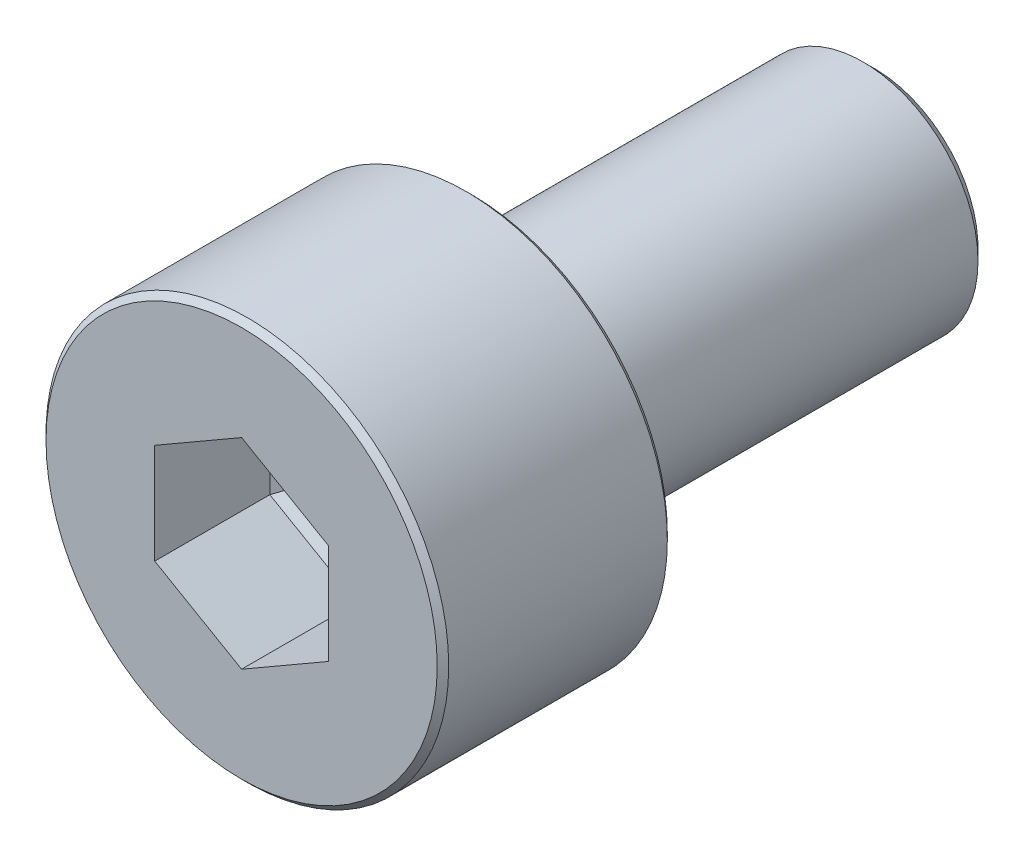
ISO-10303-21;
HEADER;
FILE_DESCRIPTION(('STEP AP214'),'2;1');
FILE_NAME('part.step','',(''),(''),'','','');
FILE_SCHEMA(('AUTOMOTIVE_DESIGN { 1 0 10303 214 1 1 1 1 }'));
ENDSEC;
DATA;
#1=APPLICATION_CONTEXT('core data for automotive mechanical design processes');
#2=APPLICATION_PROTOCOL_DEFINITION('international standard','automotive_design',2000,#1);
#3=PRODUCT_CONTEXT('',#1,'mechanical');
#4=PRODUCT('Part','Part','',(#3));
#5=PRODUCT_RELATED_PRODUCT_CATEGORY('part','',(#4));
#6=PRODUCT_DEFINITION_FORMATION('','',#4);
#7=PRODUCT_DEFINITION_CONTEXT('part definition',#1,'design');
#8=PRODUCT_DEFINITION('design','',#6,#7);
#9=PRODUCT_DEFINITION_SHAPE('','',#8);
#10=(LENGTH_UNIT() NAMED_UNIT(*) SI_UNIT(.MILLI.,.METRE.));
#11=(NAMED_UNIT(*) PLANE_ANGLE_UNIT() SI_UNIT($,.RADIAN.));
#12=(NAMED_UNIT(*) SI_UNIT($,.STERADIAN.) SOLID_ANGLE_UNIT());
#13=UNCERTAINTY_MEASURE_WITH_UNIT(LENGTH_MEASURE(1.E-05),#10,'distance_accuracy_value','');
#14=(GEOMETRIC_REPRESENTATION_CONTEXT(3) GLOBAL_UNCERTAINTY_ASSIGNED_CONTEXT((#13)) GLOBAL_UNIT_ASSIGNED_CONTEXT((#10,
#11,#12)) REPRESENTATION_CONTEXT('',''));
#15=CARTESIAN_POINT('',(0.,0.,0.));
#16=DIRECTION('',(0.,0.,1.));
#17=DIRECTION('',(1.,0.,0.));
#18=AXIS2_PLACEMENT_3D('',#15,#16,#17);
#19=CARTESIAN_POINT('',(0.,0.,7.));
#20=DIRECTION('',(0.,0.,1.));
#21=DIRECTION('',(1.,0.,0.));
#22=AXIS2_PLACEMENT_3D('',#19,#20,#21);
#23=PLANE('',#22);
#24=DIRECTION('',(-0.866025403784429,-0.500000000000017,0.));
#25=VECTOR('',#24,1.);
#26=CARTESIAN_POINT('',(-0.0433012701892444,0.0750000000000356,7.));
#27=LINE('',#26,#25);
#28=CARTESIAN_POINT('',(0.,0.100000000000016,7.));
#29=VERTEX_POINT('',#28);
#30=CARTESIAN_POINT('',(-0.0866025403782175,0.0500000000001781,7.));
#31=VERTEX_POINT('',#30);
#32=EDGE_CURVE('E64',#29,#31,#27,.T.);
#33=ORIENTED_EDGE('',*,*,#32,.T.);
#34=DIRECTION('',(0.,-1.,0.));
#35=VECTOR('',#34,1.);
#36=CARTESIAN_POINT('',(-0.0866025403782175,0.,7.));
#37=LINE('',#36,#35);
#38=CARTESIAN_POINT('',(-0.0866025403782175,-0.0500000000001216,7.00000000000001));
#39=VERTEX_POINT('',#38);
#40=EDGE_CURVE('E252',#31,#39,#37,.T.);
#41=ORIENTED_EDGE('',*,*,#40,.T.);
#42=DIRECTION('',(0.866025403784438,-0.500000000000002,0.));
#43=VECTOR('',#42,1.);
#44=CARTESIAN_POINT('',(-0.086602540378437,-0.049999999999995,7.00000000000001));
#45=LINE('',#44,#43);
#46=CARTESIAN_POINT('',(2.81120070798335E-13,-0.100000000000153,7.00000000000001));
#47=VERTEX_POINT('',#46);
#48=EDGE_CURVE('E332',#39,#47,#45,.T.);
#49=ORIENTED_EDGE('',*,*,#48,.T.);
#50=DIRECTION('',(0.866025403784429,0.500000000000017,0.));
#51=VECTOR('',#50,1.);
#52=CARTESIAN_POINT('',(0.0433012701893596,-0.0750000000002351,7.));
#53=LINE('',#52,#51);
#54=CARTESIAN_POINT('',(0.0866025403784474,-0.0500000000003115,7.));
#55=VERTEX_POINT('',#54);
#56=EDGE_CURVE('E361',#47,#55,#53,.T.);
#57=ORIENTED_EDGE('',*,*,#56,.T.);
#58=DIRECTION('',(0.,1.,0.));
#59=VECTOR('',#58,1.);
#60=CARTESIAN_POINT('',(0.0866025403784474,0.,7.));
#61=LINE('',#60,#59);
#62=CARTESIAN_POINT('',(0.0866025403784474,0.0499999999999846,7.));
#63=VERTEX_POINT('',#62);
#64=EDGE_CURVE('E359',#55,#63,#61,.T.);
#65=ORIENTED_EDGE('',*,*,#64,.T.);
#66=DIRECTION('',(0.866025403784454,-0.499999999999973,0.));
#67=VECTOR('',#66,1.);
#68=CARTESIAN_POINT('',(0.043301270189213,0.07499999999999,7.));
#69=LINE('',#68,#67);
#70=EDGE_CURVE('E343',#63,#29,#69,.F.);
#71=ORIENTED_EDGE('',*,*,#70,.T.);
#72=EDGE_LOOP('',(#33,#41,#49,#57,#65,#71));
#73=FACE_BOUND('',#72,.T.);
#74=ADVANCED_FACE('F48',(#73),#23,.T.);
#75=CARTESIAN_POINT('',(0.,1.743597812953,10.));
#76=DIRECTION('',(-0.500000000000017,0.866025403784429,0.));
#77=DIRECTION('',(-0.866025403784429,-0.500000000000017,0.));
#78=AXIS2_PLACEMENT_3D('',#75,#76,#77);
#79=PLANE('',#78);
#80=DIRECTION('',(0.,0.,1.));
#81=VECTOR('',#80,1.);
#82=CARTESIAN_POINT('',(-1.51000000000014,0.871798906476545,10.));
#83=LINE('',#82,#81);
#84=CARTESIAN_POINT('',(-1.51000000000014,0.871798906476545,8.00000000000009));
#85=VERTEX_POINT('',#84);
#86=CARTESIAN_POINT('',(-1.51000000000004,0.871798906476361,10.));
#87=VERTEX_POINT('',#86);
#88=EDGE_CURVE('E123',#85,#87,#83,.T.);
#89=ORIENTED_EDGE('',*,*,#88,.F.);
#90=DIRECTION('',(0.866025403784429,0.500000000000017,0.));
#91=VECTOR('',#90,1.);
#92=CARTESIAN_POINT('',(0.,1.743597812953,8.00000000000009));
#93=LINE('',#92,#91);
#94=CARTESIAN_POINT('',(0.,1.743597812953,8.00000000000015));
#95=VERTEX_POINT('',#94);
#96=EDGE_CURVE('E261',#85,#95,#93,.T.);
#97=ORIENTED_EDGE('',*,*,#96,.T.);
#98=DIRECTION('',(0.,0.,1.));
#99=VECTOR('',#98,1.);
#100=CARTESIAN_POINT('',(0.,1.743597812953,10.));
#101=LINE('',#100,#99);
#102=CARTESIAN_POINT('',(0.,1.74359781295288,10.));
#103=VERTEX_POINT('',#102);
#104=EDGE_CURVE('E134',#103,#95,#101,.F.);
#105=ORIENTED_EDGE('',*,*,#104,.F.);
#106=DIRECTION('',(0.866025403784348,0.500000000000157,0.));
#107=VECTOR('',#106,1.);
#108=CARTESIAN_POINT('',(-1.51,0.8717989064763,10.));
#109=LINE('',#108,#107);
#110=EDGE_CURVE('E139',#87,#103,#109,.T.);
#111=ORIENTED_EDGE('',*,*,#110,.F.);
#112=EDGE_LOOP('',(#89,#97,#105,#111));
#113=FACE_BOUND('',#112,.T.);
#114=ADVANCED_FACE('F140',(#113),#79,.F.);
#115=CARTESIAN_POINT('',(1.51,0.51807777071991,7.78478850910546));
#116=DIRECTION('',(-0.287429416581815,-0.49784235310962,0.818252602766233));
#117=DIRECTION('',(0.,-0.854302616529847,-0.519775951146508));
#118=AXIS2_PLACEMENT_3D('',#115,#116,#117);
#119=PLANE('',#118);
#120=DIRECTION('',(0.866025403784429,-0.500000000000017,0.));
#121=VECTOR('',#120,1.);
#122=CARTESIAN_POINT('',(1.50999999999994,0.871798906476335,7.99999999999989));
#123=LINE('',#122,#121);
#124=CARTESIAN_POINT('',(1.51000000000001,0.871798906476323,7.99999999999997));
#125=VERTEX_POINT('',#124);
#126=EDGE_CURVE('E328',#125,#95,#123,.F.);
#127=ORIENTED_EDGE('',*,*,#126,.T.);
#128=DIRECTION('',(0.,0.85430261652985,0.519775951146504));
#129=VECTOR('',#128,1.);
#130=CARTESIAN_POINT('',(0.,1.743597812953,8.00000000000009));
#131=LINE('',#130,#129);
#132=EDGE_CURVE('E72',#95,#29,#131,.F.);
#133=ORIENTED_EDGE('',*,*,#132,.T.);
#134=ORIENTED_EDGE('',*,*,#70,.F.);
#135=DIRECTION('',(-0.739847768434307,-0.427151308265006,-0.51977595114652));
#136=VECTOR('',#135,1.);
#137=CARTESIAN_POINT('',(0.0708011932682692,0.0408770879923621,6.98889885112316));
#138=LINE('',#137,#136);
#139=EDGE_CURVE('E254',#63,#125,#138,.F.);
#140=ORIENTED_EDGE('',*,*,#139,.T.);
#141=EDGE_LOOP('',(#127,#133,#134,#140));
#142=FACE_BOUND('',#141,.T.);
#143=ADVANCED_FACE('F282',(#142),#119,.T.);
#144=CARTESIAN_POINT('',(-0.3991506350946,-0.6913491798573,7.5));
#145=DIRECTION('',(-0.287429416581812,-0.49784235310962,-0.818252602766234));
#146=DIRECTION('',(0.,0.854302616529847,-0.519775951146508));
#147=AXIS2_PLACEMENT_3D('',#144,#145,#146);
#148=PLANE('',#147);
#149=ORIENTED_EDGE('',*,*,#48,.F.);
#150=DIRECTION('',(-0.739847768434357,-0.427151308264947,0.519775951146498));
#151=VECTOR('',#150,1.);
#152=CARTESIAN_POINT('',(-0.958976114739538,-0.553665117991564,7.61288122194148));
#153=LINE('',#152,#151);
#154=CARTESIAN_POINT('',(-1.51000000000001,-0.871798906476323,7.99999999999997));
#155=VERTEX_POINT('',#154);
#156=EDGE_CURVE('E247',#39,#155,#153,.T.);
#157=ORIENTED_EDGE('',*,*,#156,.T.);
#158=DIRECTION('',(0.866025403784429,-0.500000000000017,0.));
#159=VECTOR('',#158,1.);
#160=CARTESIAN_POINT('',(-1.51,-0.8717989064763,8.));
#161=LINE('',#160,#159);
#162=CARTESIAN_POINT('',(0.,-1.74359781295292,8.00000000000008));
#163=VERTEX_POINT('',#162);
#164=EDGE_CURVE('E211',#155,#163,#161,.T.);
#165=ORIENTED_EDGE('',*,*,#164,.T.);
#166=DIRECTION('',(0.,0.854302616529837,-0.519775951146525));
#167=VECTOR('',#166,1.);
#168=CARTESIAN_POINT('',(2.98507963139572E-13,-0.0817541759849651,6.98889885112319));
#169=LINE('',#168,#167);
#170=EDGE_CURVE('E365',#163,#47,#169,.T.);
#171=ORIENTED_EDGE('',*,*,#170,.T.);
#172=EDGE_LOOP('',(#149,#157,#165,#171));
#173=FACE_BOUND('',#172,.T.);
#174=ADVANCED_FACE('F286',(#173),#148,.F.);
#175=CARTESIAN_POINT('',(-1.51,0.8717989064763,10.));
#176=DIRECTION('',(-1.,0.,0.));
#177=DIRECTION('',(0.,0.,1.));
#178=AXIS2_PLACEMENT_3D('',#175,#176,#177);
#179=PLANE('',#178);
#180=DIRECTION('',(0.,0.,1.));
#181=VECTOR('',#180,1.);
#182=CARTESIAN_POINT('',(-1.51,-0.8717989064763,10.));
#183=LINE('',#182,#181);
#184=CARTESIAN_POINT('',(-1.51,-0.8717989064763,10.));
#185=VERTEX_POINT('',#184);
#186=EDGE_CURVE('E135',#155,#185,#183,.T.);
#187=ORIENTED_EDGE('',*,*,#186,.F.);
#188=DIRECTION('',(0.,1.,0.));
#189=VECTOR('',#188,1.);
#190=CARTESIAN_POINT('',(-1.51,0.8717989064763,8.00000000000009));
#191=LINE('',#190,#189);
#192=EDGE_CURVE('E131',#155,#85,#191,.T.);
#193=ORIENTED_EDGE('',*,*,#192,.T.);
#194=ORIENTED_EDGE('',*,*,#88,.T.);
#195=DIRECTION('',(0.,1.,0.));
#196=VECTOR('',#195,1.);
#197=CARTESIAN_POINT('',(-1.51,0.,10.));
#198=LINE('',#197,#196);
#199=EDGE_CURVE('E128',#185,#87,#198,.T.);
#200=ORIENTED_EDGE('',*,*,#199,.F.);
#201=EDGE_LOOP('',(#187,#193,#194,#200));
#202=FACE_BOUND('',#201,.T.);
#203=ADVANCED_FACE('F126',(#202),#179,.F.);
#204=CARTESIAN_POINT('',(1.51,0.8717989064763,10.));
#205=DIRECTION('',(0.500000000000017,0.866025403784429,0.));
#206=DIRECTION('',(-0.866025403784429,0.500000000000017,0.));
#207=AXIS2_PLACEMENT_3D('',#204,#205,#206);
#208=PLANE('',#207);
#209=DIRECTION('',(0.866025403784348,-0.500000000000157,0.));
#210=VECTOR('',#209,1.);
#211=CARTESIAN_POINT('',(0.,1.743597812953,10.));
#212=LINE('',#211,#210);
#213=CARTESIAN_POINT('',(1.51,0.8717989064763,10.));
#214=VERTEX_POINT('',#213);
#215=EDGE_CURVE('E196',#103,#214,#212,.T.);
#216=ORIENTED_EDGE('',*,*,#215,.F.);
#217=ORIENTED_EDGE('',*,*,#104,.T.);
#218=ORIENTED_EDGE('',*,*,#126,.F.);
#219=DIRECTION('',(0.,0.,-1.));
#220=VECTOR('',#219,1.);
#221=CARTESIAN_POINT('',(1.51,0.8717989064763,10.));
#222=LINE('',#221,#220);
#223=EDGE_CURVE('E228',#125,#214,#222,.F.);
#224=ORIENTED_EDGE('',*,*,#223,.T.);
#225=EDGE_LOOP('',(#216,#217,#218,#224));
#226=FACE_BOUND('',#225,.T.);
#227=ADVANCED_FACE('F334',(#226),#208,.F.);
#228=CARTESIAN_POINT('',(1.51,-0.8717989064763,10.));
#229=DIRECTION('',(1.,0.,0.));
#230=DIRECTION('',(0.,0.,-1.));
#231=AXIS2_PLACEMENT_3D('',#228,#229,#230);
#232=PLANE('',#231);
#233=ORIENTED_EDGE('',*,*,#223,.F.);
#234=DIRECTION('',(0.,-1.,0.));
#235=VECTOR('',#234,1.);
#236=CARTESIAN_POINT('',(1.51,-0.8717989064763,8.00000000000004));
#237=LINE('',#236,#235);
#238=CARTESIAN_POINT('',(1.51000000000014,-0.871798906476545,8.00000000000004));
#239=VERTEX_POINT('',#238);
#240=EDGE_CURVE('E232',#125,#239,#237,.T.);
#241=ORIENTED_EDGE('',*,*,#240,.T.);
#242=DIRECTION('',(0.,0.,1.));
#243=VECTOR('',#242,1.);
#244=CARTESIAN_POINT('',(1.51000000000014,-0.871798906476545,10.));
#245=LINE('',#244,#243);
#246=CARTESIAN_POINT('',(1.51000000000004,-0.871798906476361,10.));
#247=VERTEX_POINT('',#246);
#248=EDGE_CURVE('E231',#239,#247,#245,.T.);
#249=ORIENTED_EDGE('',*,*,#248,.T.);
#250=DIRECTION('',(0.,1.,0.));
#251=VECTOR('',#250,1.);
#252=CARTESIAN_POINT('',(1.51,0.,10.));
#253=LINE('',#252,#251);
#254=EDGE_CURVE('E201',#214,#247,#253,.F.);
#255=ORIENTED_EDGE('',*,*,#254,.F.);
#256=EDGE_LOOP('',(#233,#241,#249,#255));
#257=FACE_BOUND('',#256,.T.);
#258=ADVANCED_FACE('F227',(#257),#232,.F.);
#259=CARTESIAN_POINT('',(0.,-1.743597812953,10.));
#260=DIRECTION('',(0.500000000000017,-0.866025403784429,0.));
#261=DIRECTION('',(0.866025403784429,0.500000000000017,0.));
#262=AXIS2_PLACEMENT_3D('',#259,#260,#261);
#263=PLANE('',#262);
#264=ORIENTED_EDGE('',*,*,#248,.F.);
#265=DIRECTION('',(-0.866025403784429,-0.500000000000017,0.));
#266=VECTOR('',#265,1.);
#267=CARTESIAN_POINT('',(0.,-1.743597812953,8.00000000000004));
#268=LINE('',#267,#266);
#269=EDGE_CURVE('E238',#239,#163,#268,.T.);
#270=ORIENTED_EDGE('',*,*,#269,.T.);
#271=DIRECTION('',(0.,0.,1.));
#272=VECTOR('',#271,1.);
#273=CARTESIAN_POINT('',(1.4137996329211E-13,-1.74359781295276,10.));
#274=LINE('',#273,#272);
#275=CARTESIAN_POINT('',(0.,-1.74359781295294,10.));
#276=VERTEX_POINT('',#275);
#277=EDGE_CURVE('E207',#163,#276,#274,.T.);
#278=ORIENTED_EDGE('',*,*,#277,.T.);
#279=DIRECTION('',(-0.866025403784348,-0.500000000000157,0.));
#280=VECTOR('',#279,1.);
#281=CARTESIAN_POINT('',(1.51,-0.8717989064763,10.));
#282=LINE('',#281,#280);
#283=EDGE_CURVE('E156',#247,#276,#282,.T.);
#284=ORIENTED_EDGE('',*,*,#283,.F.);
#285=EDGE_LOOP('',(#264,#270,#278,#284));
#286=FACE_BOUND('',#285,.T.);
#287=ADVANCED_FACE('F236',(#286),#263,.F.);
#288=CARTESIAN_POINT('',(-1.51,-0.8717989064763,10.));
#289=DIRECTION('',(-0.500000000000017,-0.866025403784429,0.));
#290=DIRECTION('',(0.866025403784429,-0.500000000000017,0.));
#291=AXIS2_PLACEMENT_3D('',#288,#289,#290);
#292=PLANE('',#291);
#293=DIRECTION('',(-0.866025403784348,0.500000000000157,0.));
#294=VECTOR('',#293,1.);
#295=CARTESIAN_POINT('',(0.,-1.743597812953,10.));
#296=LINE('',#295,#294);
#297=EDGE_CURVE('E150',#276,#185,#296,.T.);
#298=ORIENTED_EDGE('',*,*,#297,.F.);
#299=ORIENTED_EDGE('',*,*,#277,.F.);
#300=ORIENTED_EDGE('',*,*,#164,.F.);
#301=ORIENTED_EDGE('',*,*,#186,.T.);
#302=EDGE_LOOP('',(#298,#299,#300,#301));
#303=FACE_BOUND('',#302,.T.);
#304=ADVANCED_FACE('F243',(#303),#292,.F.);
#305=CARTESIAN_POINT('',(0.,0.,6.));
#306=DIRECTION('',(0.,0.,1.));
#307=DIRECTION('',(1.,0.,0.));
#308=AXIS2_PLACEMENT_3D('',#305,#306,#307);
#309=PLANE('',#308);
#310=CARTESIAN_POINT('',(0.,0.,6.));
#311=DIRECTION('',(0.,0.,1.));
#312=DIRECTION('',(1.,0.,0.));
#313=AXIS2_PLACEMENT_3D('',#310,#311,#312);
#314=CIRCLE('',#313,3.3999994962381);
#315=CARTESIAN_POINT('',(3.3999994962381,0.,6.));
#316=VERTEX_POINT('',#315);
#317=EDGE_CURVE('E353',#316,#316,#314,.F.);
#318=ORIENTED_EDGE('',*,*,#317,.T.);
#319=EDGE_LOOP('',(#318));
#320=FACE_BOUND('',#319,.T.);
#321=CARTESIAN_POINT('',(0.,0.,6.));
#322=DIRECTION('',(0.,0.,-1.));
#323=DIRECTION('',(-1.,0.,0.));
#324=AXIS2_PLACEMENT_3D('',#321,#322,#323);
#325=CIRCLE('',#324,2.);
#326=CARTESIAN_POINT('',(-2.,0.,6.));
#327=VERTEX_POINT('',#326);
#328=EDGE_CURVE('E145',#327,#327,#325,.T.);
#329=ORIENTED_EDGE('',*,*,#328,.F.);
#330=EDGE_LOOP('',(#329));
#331=FACE_BOUND('',#330,.T.);
#332=ADVANCED_FACE('F438',(#320,#331),#309,.F.);
#333=CARTESIAN_POINT('',(0.,0.,10.));
#334=DIRECTION('',(0.,0.,1.));
#335=DIRECTION('',(1.,0.,0.));
#336=AXIS2_PLACEMENT_3D('',#333,#334,#335);
#337=PLANE('',#336);
#338=CARTESIAN_POINT('',(0.,0.,10.));
#339=DIRECTION('',(0.,0.,1.));
#340=DIRECTION('',(1.,0.,0.));
#341=AXIS2_PLACEMENT_3D('',#338,#339,#340);
#342=CIRCLE('',#341,3.3999994962381);
#343=CARTESIAN_POINT('',(3.3999994962381,0.,10.));
#344=VERTEX_POINT('',#343);
#345=EDGE_CURVE('E356',#344,#344,#342,.T.);
#346=ORIENTED_EDGE('',*,*,#345,.T.);
#347=EDGE_LOOP('',(#346));
#348=FACE_BOUND('',#347,.T.);
#349=ORIENTED_EDGE('',*,*,#199,.T.);
#350=ORIENTED_EDGE('',*,*,#110,.T.);
#351=ORIENTED_EDGE('',*,*,#215,.T.);
#352=ORIENTED_EDGE('',*,*,#254,.T.);
#353=ORIENTED_EDGE('',*,*,#283,.T.);
#354=ORIENTED_EDGE('',*,*,#297,.T.);
#355=EDGE_LOOP('',(#349,#350,#351,#352,#353,#354));
#356=FACE_BOUND('',#355,.T.);
#357=ADVANCED_FACE('F147',(#348,#356),#337,.T.);
#358=CARTESIAN_POINT('',(0.,0.,6.));
#359=DIRECTION('',(0.,0.,1.));
#360=DIRECTION('',(1.,0.,0.));
#361=AXIS2_PLACEMENT_3D('',#358,#359,#360);
#362=CYLINDRICAL_SURFACE('',#361,3.5);
#363=CARTESIAN_POINT('',(0.,0.,6.10000049500801));
#364=DIRECTION('',(0.,0.,1.));
#365=DIRECTION('',(1.,0.,0.));
#366=AXIS2_PLACEMENT_3D('',#363,#364,#365);
#367=CIRCLE('',#366,3.5);
#368=CARTESIAN_POINT('',(3.5,0.,6.10000049500801));
#369=VERTEX_POINT('',#368);
#370=EDGE_CURVE('E350',#369,#369,#367,.T.);
#371=CARTESIAN_POINT('',(0.,0.,9.89999950499199));
#372=DIRECTION('',(0.,0.,1.));
#373=DIRECTION('',(1.,0.,0.));
#374=AXIS2_PLACEMENT_3D('',#371,#372,#373);
#375=CIRCLE('',#374,3.5);
#376=CARTESIAN_POINT('',(3.5,0.,9.89999950499199));
#377=VERTEX_POINT('',#376);
#378=EDGE_CURVE('E347',#377,#377,#375,.F.);
#379=CARTESIAN_POINT('',(3.5,0.,6.10000049500801));
#380=CARTESIAN_POINT('',(3.5,0.,6.13958381802868));
#381=CARTESIAN_POINT('',(3.5,0.,6.17916714104934));
#382=CARTESIAN_POINT('',(3.5,0.,6.25833378709068));
#383=CARTESIAN_POINT('',(3.5,0.,6.29791711011134));
#384=CARTESIAN_POINT('',(3.5,0.,6.37708375615268));
#385=CARTESIAN_POINT('',(3.5,0.,6.41666707917334));
#386=CARTESIAN_POINT('',(3.5,0.,6.49583372521468));
#387=CARTESIAN_POINT('',(3.5,0.,6.53541704823534));
#388=CARTESIAN_POINT('',(3.5,0.,6.61458369427667));
#389=CARTESIAN_POINT('',(3.5,0.,6.65416701729734));
#390=CARTESIAN_POINT('',(3.5,0.,6.73333366333867));
#391=CARTESIAN_POINT('',(3.5,0.,6.77291698635934));
#392=CARTESIAN_POINT('',(3.5,0.,6.85208363240067));
#393=CARTESIAN_POINT('',(3.5,0.,6.89166695542134));
#394=CARTESIAN_POINT('',(3.5,0.,6.97083360146267));
#395=CARTESIAN_POINT('',(3.5,0.,7.01041692448334));
#396=CARTESIAN_POINT('',(3.5,0.,7.08958357052467));
#397=CARTESIAN_POINT('',(3.5,0.,7.12916689354534));
#398=CARTESIAN_POINT('',(3.5,0.,7.20833353958667));
#399=CARTESIAN_POINT('',(3.5,0.,7.24791686260734));
#400=CARTESIAN_POINT('',(3.5,0.,7.32708350864867));
#401=CARTESIAN_POINT('',(3.5,0.,7.36666683166934));
#402=CARTESIAN_POINT('',(3.5,0.,7.44583347771067));
#403=CARTESIAN_POINT('',(3.5,0.,7.48541680073134));
#404=CARTESIAN_POINT('',(3.5,0.,7.56458344677267));
#405=CARTESIAN_POINT('',(3.5,0.,7.60416676979334));
#406=CARTESIAN_POINT('',(3.5,0.,7.68333341583467));
#407=CARTESIAN_POINT('',(3.5,0.,7.72291673885533));
#408=CARTESIAN_POINT('',(3.5,0.,7.80208338489667));
#409=CARTESIAN_POINT('',(3.5,0.,7.84166670791733));
#410=CARTESIAN_POINT('',(3.5,0.,7.92083335395867));
#411=CARTESIAN_POINT('',(3.5,0.,7.96041667697933));
#412=CARTESIAN_POINT('',(3.5,0.,8.03958332302067));
#413=CARTESIAN_POINT('',(3.5,0.,8.07916664604133));
#414=CARTESIAN_POINT('',(3.5,0.,8.15833329208267));
#415=CARTESIAN_POINT('',(3.5,0.,8.19791661510333));
#416=CARTESIAN_POINT('',(3.5,0.,8.27708326114466));
#417=CARTESIAN_POINT('',(3.5,0.,8.31666658416533));
#418=CARTESIAN_POINT('',(3.5,0.,8.39583323020666));
#419=CARTESIAN_POINT('',(3.5,0.,8.43541655322733));
#420=CARTESIAN_POINT('',(3.5,0.,8.51458319926866));
#421=CARTESIAN_POINT('',(3.5,0.,8.55416652228933));
#422=CARTESIAN_POINT('',(3.5,0.,8.63333316833066));
#423=CARTESIAN_POINT('',(3.5,0.,8.67291649135133));
#424=CARTESIAN_POINT('',(3.5,0.,8.75208313739266));
#425=CARTESIAN_POINT('',(3.5,0.,8.79166646041333));
#426=CARTESIAN_POINT('',(3.5,0.,8.87083310645466));
#427=CARTESIAN_POINT('',(3.5,0.,8.91041642947533));
#428=CARTESIAN_POINT('',(3.5,0.,8.98958307551666));
#429=CARTESIAN_POINT('',(3.5,0.,9.02916639853733));
#430=CARTESIAN_POINT('',(3.5,0.,9.10833304457866));
#431=CARTESIAN_POINT('',(3.5,0.,9.14791636759933));
#432=CARTESIAN_POINT('',(3.5,0.,9.22708301364066));
#433=CARTESIAN_POINT('',(3.5,0.,9.26666633666133));
#434=CARTESIAN_POINT('',(3.5,0.,9.34583298270266));
#435=CARTESIAN_POINT('',(3.5,0.,9.38541630572332));
#436=CARTESIAN_POINT('',(3.5,0.,9.46458295176466));
#437=CARTESIAN_POINT('',(3.5,0.,9.50416627478532));
#438=CARTESIAN_POINT('',(3.5,0.,9.58333292082666));
#439=CARTESIAN_POINT('',(3.5,0.,9.62291624384732));
#440=CARTESIAN_POINT('',(3.5,0.,9.70208288988866));
#441=CARTESIAN_POINT('',(3.5,0.,9.74166621290932));
#442=CARTESIAN_POINT('',(3.5,0.,9.82083285895066));
#443=CARTESIAN_POINT('',(3.5,0.,9.86041618197132));
#444=CARTESIAN_POINT('',(3.5,0.,9.89999950499199));
#445=B_SPLINE_CURVE_WITH_KNOTS('',3,(#379,#380,#381,#382,#383,#384,#385,#386,#387,#388,#389,
#390,#391,#392,#393,#394,#395,#396,#397,#398,#399,#400,#401,#402,#403,#404,#405,#406,#407,#408,
#409,#410,#411,#412,#413,#414,#415,#416,#417,#418,#419,#420,#421,#422,#423,#424,#425,#426,#427,
#428,#429,#430,#431,#432,#433,#434,#435,#436,#437,#438,#439,#440,#441,#442,#443,#444),
.UNSPECIFIED.,.F.,.F.,(4,2,2,2,2,2,2,2,2,2,2,2,2,2,2,2,2,2,2,2,2,2,2,2,2,2,2,2,2,2,2,2,4),(0.,
0.118749969061999,0.237499938123998,0.356249907185998,0.474999876247996,0.593749845309996,
0.712499814371995,0.831249783433995,0.949999752495994,1.06874972155799,1.18749969061999,
1.30624965968199,1.42499962874399,1.54374959780599,1.66249956686799,1.78124953592999,
1.89999950499199,2.01874947405399,2.13749944311599,2.25624941217799,2.37499938123998,
2.49374935030199,2.61249931936398,2.73124928842598,2.84999925748798,2.96874922654998,
3.08749919561198,3.20624916467398,3.32499913373598,3.44374910279798,3.56249907185998,
3.68124904092198,3.79999900998398),.UNSPECIFIED.);
#446=EDGE_CURVE('BSEAM422',#369,#377,#445,.T.);
#447=ORIENTED_EDGE('',*,*,#370,.T.);
#448=ORIENTED_EDGE('',*,*,#378,.T.);
#449=ORIENTED_EDGE('',*,*,#446,.T.);
#450=ORIENTED_EDGE('',*,*,#446,.F.);
#451=EDGE_LOOP('',(#447,#449,#448,#450));
#452=FACE_BOUND('',#451,.T.);
#453=ADVANCED_FACE('F422',(#452),#362,.T.);
#454=CARTESIAN_POINT('',(0.,0.,-1.));
#455=DIRECTION('',(0.,0.,1.));
#456=DIRECTION('',(1.,0.,0.));
#457=AXIS2_PLACEMENT_3D('',#454,#455,#456);
#458=CYLINDRICAL_SURFACE('',#457,2.);
#459=CARTESIAN_POINT('',(0.,0.,-0.79999922881674));
#460=DIRECTION('',(0.,0.,-1.));
#461=DIRECTION('',(-1.,0.,0.));
#462=AXIS2_PLACEMENT_3D('',#459,#460,#461);
#463=CIRCLE('',#462,2.);
#464=CARTESIAN_POINT('',(-2.,0.,-0.79999922881674));
#465=VERTEX_POINT('',#464);
#466=EDGE_CURVE('E12',#465,#465,#463,.F.);
#467=ORIENTED_EDGE('',*,*,#466,.T.);
#468=EDGE_LOOP('',(#467));
#469=FACE_BOUND('',#468,.T.);
#470=ORIENTED_EDGE('',*,*,#328,.T.);
#471=EDGE_LOOP('',(#470));
#472=FACE_BOUND('',#471,.T.);
#473=ADVANCED_FACE('F426',(#469,#472),#458,.T.);
#474=CARTESIAN_POINT('',(0.,0.,-1.));
#475=DIRECTION('',(0.,0.,-1.));
#476=DIRECTION('',(-1.,0.,0.));
#477=AXIS2_PLACEMENT_3D('',#474,#475,#476);
#478=PLANE('',#477);
#479=CARTESIAN_POINT('',(0.,0.,-1.));
#480=DIRECTION('',(0.,0.,-1.));
#481=DIRECTION('',(-1.,0.,0.));
#482=AXIS2_PLACEMENT_3D('',#479,#480,#481);
#483=CIRCLE('',#482,1.79999932948643);
#484=CARTESIAN_POINT('',(-1.79999932948643,0.,-1.));
#485=VERTEX_POINT('',#484);
#486=EDGE_CURVE('E57',#485,#485,#483,.T.);
#487=ORIENTED_EDGE('',*,*,#486,.T.);
#488=EDGE_LOOP('',(#487));
#489=FACE_BOUND('',#488,.T.);
#490=ADVANCED_FACE('F267',(#489),#478,.T.);
#491=CARTESIAN_POINT('',(0.,0.,6.10000049500801));
#492=DIRECTION('',(0.,0.,1.));
#493=DIRECTION('',(1.,0.,0.));
#494=AXIS2_PLACEMENT_3D('',#491,#492,#493);
#495=CONICAL_SURFACE('',#494,3.5,0.785398207166665);
#496=CARTESIAN_POINT('',(3.3999994962381,0.,6.));
#497=CARTESIAN_POINT('',(3.40104116815229,0.,6.001041671823));
#498=CARTESIAN_POINT('',(3.40208284006647,0.,6.002083343646));
#499=CARTESIAN_POINT('',(3.40416618389485,0.,6.004166687292));
#500=CARTESIAN_POINT('',(3.40520785580903,0.,6.005208359115));
#501=CARTESIAN_POINT('',(3.40729119963741,0.,6.007291702761));
#502=CARTESIAN_POINT('',(3.40833287155159,0.,6.008333374584));
#503=CARTESIAN_POINT('',(3.41041621537997,0.,6.01041671823));
#504=CARTESIAN_POINT('',(3.41145788729415,0.,6.011458390053));
#505=CARTESIAN_POINT('',(3.41354123112253,0.,6.013541733699));
#506=CARTESIAN_POINT('',(3.41458290303671,0.,6.014583405522));
#507=CARTESIAN_POINT('',(3.41666624686508,0.,6.016666749168));
#508=CARTESIAN_POINT('',(3.41770791877927,0.,6.017708420991));
#509=CARTESIAN_POINT('',(3.41979126260764,0.,6.019791764637));
#510=CARTESIAN_POINT('',(3.42083293452183,0.,6.02083343646));
#511=CARTESIAN_POINT('',(3.4229162783502,0.,6.022916780106));
#512=CARTESIAN_POINT('',(3.42395795026439,0.,6.023958451929));
#513=CARTESIAN_POINT('',(3.42604129409276,0.,6.026041795575));
#514=CARTESIAN_POINT('',(3.42708296600695,0.,6.027083467398));
#515=CARTESIAN_POINT('',(3.42916630983532,0.,6.029166811044));
#516=CARTESIAN_POINT('',(3.43020798174951,0.,6.030208482867));
#517=CARTESIAN_POINT('',(3.43229132557788,0.,6.032291826513));
#518=CARTESIAN_POINT('',(3.43333299749207,0.,6.033333498336));
#519=CARTESIAN_POINT('',(3.43541634132044,0.,6.035416841982));
#520=CARTESIAN_POINT('',(3.43645801323463,0.,6.036458513805));
#521=CARTESIAN_POINT('',(3.438541357063,0.,6.038541857451));
#522=CARTESIAN_POINT('',(3.43958302897719,0.,6.039583529274));
#523=CARTESIAN_POINT('',(3.44166637280556,0.,6.04166687292));
#524=CARTESIAN_POINT('',(3.44270804471975,0.,6.042708544743));
#525=CARTESIAN_POINT('',(3.44479138854812,0.,6.044791888389));
#526=CARTESIAN_POINT('',(3.4458330604623,0.,6.045833560212));
#527=CARTESIAN_POINT('',(3.44791640429068,0.,6.04791690385801));
#528=CARTESIAN_POINT('',(3.44895807620486,0.,6.048958575681));
#529=CARTESIAN_POINT('',(3.45104142003324,0.,6.05104191932701));
#530=CARTESIAN_POINT('',(3.45208309194742,0.,6.05208359115001));
#531=CARTESIAN_POINT('',(3.4541664357758,0.,6.05416693479601));
#532=CARTESIAN_POINT('',(3.45520810768998,0.,6.05520860661901));
#533=CARTESIAN_POINT('',(3.45729145151836,0.,6.05729195026501));
#534=CARTESIAN_POINT('',(3.45833312343254,0.,6.05833362208801));
#535=CARTESIAN_POINT('',(3.46041646726091,0.,6.06041696573401));
#536=CARTESIAN_POINT('',(3.4614581391751,0.,6.06145863755701));
#537=CARTESIAN_POINT('',(3.46354148300347,0.,6.06354198120301));
#538=CARTESIAN_POINT('',(3.46458315491766,0.,6.06458365302601));
#539=CARTESIAN_POINT('',(3.46666649874603,0.,6.06666699667201));
#540=CARTESIAN_POINT('',(3.46770817066022,0.,6.06770866849501));
#541=CARTESIAN_POINT('',(3.46979151448859,0.,6.06979201214101));
#542=CARTESIAN_POINT('',(3.47083318640278,0.,6.07083368396401));
#543=CARTESIAN_POINT('',(3.47291653023115,0.,6.07291702761001));
#544=CARTESIAN_POINT('',(3.47395820214534,0.,6.07395869943301));
#545=CARTESIAN_POINT('',(3.47604154597371,0.,6.07604204307901));
#546=CARTESIAN_POINT('',(3.4770832178879,0.,6.07708371490201));
#547=CARTESIAN_POINT('',(3.47916656171627,0.,6.07916705854801));
#548=CARTESIAN_POINT('',(3.48020823363046,0.,6.08020873037101));
#549=CARTESIAN_POINT('',(3.48229157745883,0.,6.08229207401701));
#550=CARTESIAN_POINT('',(3.48333324937302,0.,6.08333374584001));
#551=CARTESIAN_POINT('',(3.48541659320139,0.,6.08541708948601));
#552=CARTESIAN_POINT('',(3.48645826511558,0.,6.08645876130901));
#553=CARTESIAN_POINT('',(3.48854160894395,0.,6.08854210495501));
#554=CARTESIAN_POINT('',(3.48958328085814,0.,6.08958377677801));
#555=CARTESIAN_POINT('',(3.49166662468651,0.,6.09166712042401));
#556=CARTESIAN_POINT('',(3.49270829660069,0.,6.09270879224701));
#557=CARTESIAN_POINT('',(3.49479164042907,0.,6.09479213589301));
#558=CARTESIAN_POINT('',(3.49583331234325,0.,6.09583380771601));
#559=CARTESIAN_POINT('',(3.49791665617163,0.,6.09791715136201));
#560=CARTESIAN_POINT('',(3.49895832808581,0.,6.09895882318501));
#561=CARTESIAN_POINT('',(3.5,0.,6.10000049500801));
#562=B_SPLINE_CURVE_WITH_KNOTS('',3,(#496,#497,#498,#499,#500,#501,#502,#503,#504,#505,#506,
#507,#508,#509,#510,#511,#512,#513,#514,#515,#516,#517,#518,#519,#520,#521,#522,#523,#524,#525,
#526,#527,#528,#529,#530,#531,#532,#533,#534,#535,#536,#537,#538,#539,#540,#541,#542,#543,#544,
#545,#546,#547,#548,#549,#550,#551,#552,#553,#554,#555,#556,#557,#558,#559,#560,#561),
.UNSPECIFIED.,.F.,.F.,(4,2,2,2,2,2,2,2,2,2,2,2,2,2,2,2,2,2,2,2,2,2,2,2,2,2,2,2,2,2,2,2,4),(0.,
0.00441943945232165,0.00883887890464329,0.0132583183569643,0.0176777578092863,
0.0220971972616073,0.026516636713929,0.03093607616625,0.0353555156185716,0.0397749550708933,
0.0441943945232143,0.0486138339755363,0.0530332734278573,0.057452712880179,0.0618721523325,
0.0662915917848216,0.0707110312371427,0.0751304706894646,0.0795499101417863,0.0839693495941073,
0.088388789046429,0.09280822849875,0.0972276679510716,0.101647107403393,0.106066546855715,
0.110485986308036,0.114905425760357,0.119324865212679,0.123744304665,0.128163744117322,
0.132583183569643,0.137002623021965,0.141422062474286),.UNSPECIFIED.);
#563=EDGE_CURVE('BSEAM291',#316,#369,#562,.T.);
#564=ORIENTED_EDGE('',*,*,#317,.F.);
#565=ORIENTED_EDGE('',*,*,#370,.F.);
#566=ORIENTED_EDGE('',*,*,#563,.T.);
#567=ORIENTED_EDGE('',*,*,#563,.F.);
#568=EDGE_LOOP('',(#564,#566,#565,#567));
#569=FACE_BOUND('',#568,.T.);
#570=ADVANCED_FACE('F291',(#569),#495,.T.);
#571=CARTESIAN_POINT('',(0.,0.,9.89999950499199));
#572=DIRECTION('',(0.,0.,-1.));
#573=DIRECTION('',(-1.,0.,0.));
#574=AXIS2_PLACEMENT_3D('',#571,#572,#573);
#575=CONICAL_SURFACE('',#574,3.5,0.785398207166673);
#576=ORIENTED_EDGE('',*,*,#345,.F.);
#577=EDGE_LOOP('',(#576));
#578=FACE_BOUND('',#577,.T.);
#579=ORIENTED_EDGE('',*,*,#378,.F.);
#580=EDGE_LOOP('',(#579));
#581=FACE_BOUND('',#580,.T.);
#582=ADVANCED_FACE('F297',(#578,#581),#575,.T.);
#583=CARTESIAN_POINT('',(0.0866025403784474,0.,7.));
#584=DIRECTION('',(0.574858833163706,0.,-0.818252602766201));
#585=DIRECTION('',(0.,1.,0.));
#586=AXIS2_PLACEMENT_3D('',#583,#584,#585);
#587=PLANE('',#586);
#588=ORIENTED_EDGE('',*,*,#139,.F.);
#589=ORIENTED_EDGE('',*,*,#64,.F.);
#590=DIRECTION('',(0.739847768434347,-0.427151308264904,0.519775951146548));
#591=VECTOR('',#590,1.);
#592=CARTESIAN_POINT('',(0.0708011932683161,-0.0408770879927188,6.98889885112319));
#593=LINE('',#592,#591);
#594=EDGE_CURVE('E257',#239,#55,#593,.F.);
#595=ORIENTED_EDGE('',*,*,#594,.F.);
#596=ORIENTED_EDGE('',*,*,#240,.F.);
#597=EDGE_LOOP('',(#588,#589,#595,#596));
#598=FACE_BOUND('',#597,.T.);
#599=ADVANCED_FACE('F304',(#598),#587,.F.);
#600=CARTESIAN_POINT('',(0.0433012701893597,-0.0750000000002352,7.));
#601=DIRECTION('',(0.287429416581863,-0.497842353109644,-0.818252602766201));
#602=DIRECTION('',(0.866025403784429,0.500000000000017,0.));
#603=AXIS2_PLACEMENT_3D('',#600,#601,#602);
#604=PLANE('',#603);
#605=ORIENTED_EDGE('',*,*,#170,.F.);
#606=ORIENTED_EDGE('',*,*,#269,.F.);
#607=ORIENTED_EDGE('',*,*,#594,.T.);
#608=ORIENTED_EDGE('',*,*,#56,.F.);
#609=EDGE_LOOP('',(#605,#606,#607,#608));
#610=FACE_BOUND('',#609,.T.);
#611=ADVANCED_FACE('F307',(#610),#604,.F.);
#612=CARTESIAN_POINT('',(0.,1.743597812953,8.00000000000009));
#613=DIRECTION('',(-0.287429416581842,0.497842353109608,-0.818252602766231));
#614=DIRECTION('',(0.866025403784429,0.500000000000017,0.));
#615=AXIS2_PLACEMENT_3D('',#612,#613,#614);
#616=PLANE('',#615);
#617=ORIENTED_EDGE('',*,*,#132,.F.);
#618=ORIENTED_EDGE('',*,*,#96,.F.);
#619=DIRECTION('',(0.739847768434368,-0.427151308264917,-0.519775951146506));
#620=VECTOR('',#619,1.);
#621=CARTESIAN_POINT('',(-1.51,0.8717989064763,8.00000000000009));
#622=LINE('',#621,#620);
#623=EDGE_CURVE('E249',#31,#85,#622,.F.);
#624=ORIENTED_EDGE('',*,*,#623,.F.);
#625=ORIENTED_EDGE('',*,*,#32,.F.);
#626=EDGE_LOOP('',(#617,#618,#624,#625));
#627=FACE_BOUND('',#626,.T.);
#628=ADVANCED_FACE('F274',(#627),#616,.F.);
#629=CARTESIAN_POINT('',(-1.51,0.8717989064763,8.00000000000009));
#630=DIRECTION('',(-0.574858833163664,0.,-0.81825260276623));
#631=DIRECTION('',(0.,1.,0.));
#632=AXIS2_PLACEMENT_3D('',#629,#630,#631);
#633=PLANE('',#632);
#634=ORIENTED_EDGE('',*,*,#156,.F.);
#635=ORIENTED_EDGE('',*,*,#40,.F.);
#636=ORIENTED_EDGE('',*,*,#623,.T.);
#637=ORIENTED_EDGE('',*,*,#192,.F.);
#638=EDGE_LOOP('',(#634,#635,#636,#637));
#639=FACE_BOUND('',#638,.T.);
#640=ADVANCED_FACE('F246',(#639),#633,.F.);
#641=CARTESIAN_POINT('',(0.,0.,-1.));
#642=DIRECTION('',(0.,0.,1.));
#643=DIRECTION('',(1.,0.,0.));
#644=AXIS2_PLACEMENT_3D('',#641,#642,#643);
#645=CONICAL_SURFACE('',#644,1.79999932948643,0.785397911724123);
#646=ORIENTED_EDGE('',*,*,#466,.F.);
#647=EDGE_LOOP('',(#646));
#648=FACE_BOUND('',#647,.T.);
#649=ORIENTED_EDGE('',*,*,#486,.F.);
#650=EDGE_LOOP('',(#649));
#651=FACE_BOUND('',#650,.T.);
#652=ADVANCED_FACE('F51',(#648,#651),#645,.T.);
#653=CLOSED_SHELL('',(#74,#114,#143,#174,#203,#227,#258,#287,#304,#332,#357,#453,#473,#490,#570,
#582,#599,#611,#628,#640,#652));
#654=MANIFOLD_SOLID_BREP('B2',#653);
#655=ADVANCED_BREP_SHAPE_REPRESENTATION('',(#18,#654),#14);
#656=SHAPE_DEFINITION_REPRESENTATION(#9,#655);
ENDSEC;
END-ISO-10303-21;
